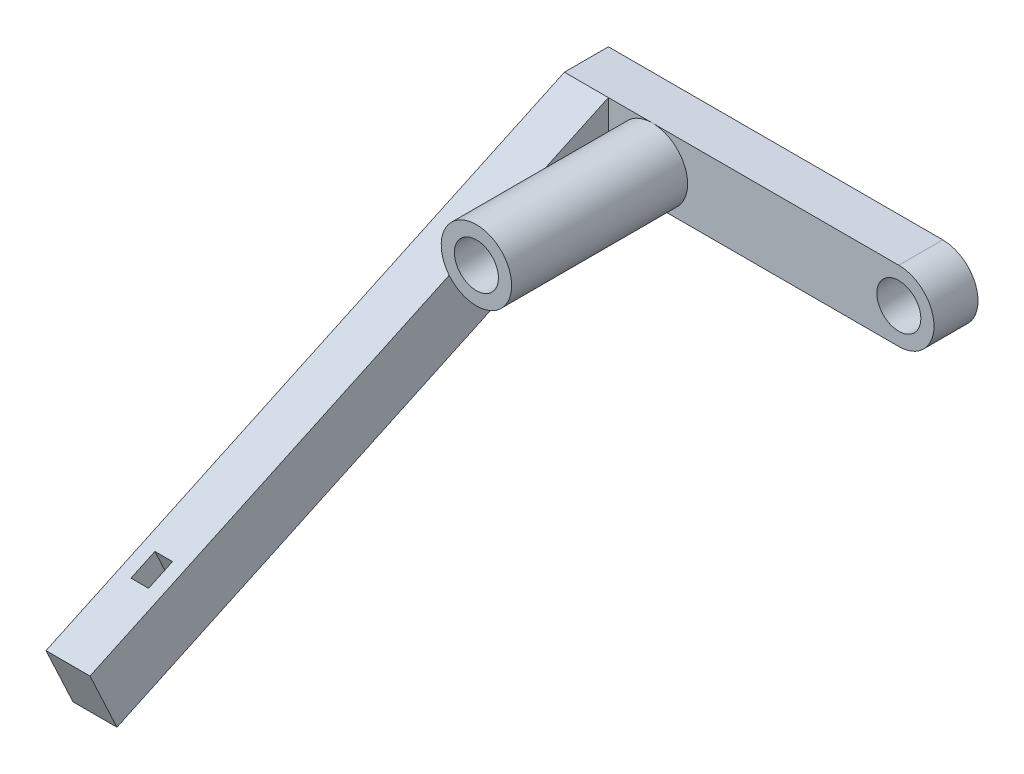
ISO-10303-21;
HEADER;
FILE_DESCRIPTION(('STEP AP214'),'2;1');
FILE_NAME('part.step','',(''),(''),'','','');
FILE_SCHEMA(('AUTOMOTIVE_DESIGN { 1 0 10303 214 1 1 1 1 }'));
ENDSEC;
DATA;
#1=APPLICATION_CONTEXT('core data for automotive mechanical design processes');
#2=APPLICATION_PROTOCOL_DEFINITION('international standard','automotive_design',2000,#1);
#3=PRODUCT_CONTEXT('',#1,'mechanical');
#4=PRODUCT('Part','Part','',(#3));
#5=PRODUCT_RELATED_PRODUCT_CATEGORY('part','',(#4));
#6=PRODUCT_DEFINITION_FORMATION('','',#4);
#7=PRODUCT_DEFINITION_CONTEXT('part definition',#1,'design');
#8=PRODUCT_DEFINITION('design','',#6,#7);
#9=PRODUCT_DEFINITION_SHAPE('','',#8);
#10=(LENGTH_UNIT() NAMED_UNIT(*) SI_UNIT(.MILLI.,.METRE.));
#11=(NAMED_UNIT(*) PLANE_ANGLE_UNIT() SI_UNIT($,.RADIAN.));
#12=(NAMED_UNIT(*) SI_UNIT($,.STERADIAN.) SOLID_ANGLE_UNIT());
#13=UNCERTAINTY_MEASURE_WITH_UNIT(LENGTH_MEASURE(1.E-05),#10,'distance_accuracy_value','');
#14=(GEOMETRIC_REPRESENTATION_CONTEXT(3) GLOBAL_UNCERTAINTY_ASSIGNED_CONTEXT((#13)) GLOBAL_UNIT_ASSIGNED_CONTEXT((#10,
#11,#12)) REPRESENTATION_CONTEXT('',''));
#15=CARTESIAN_POINT('',(0.,0.,0.));
#16=DIRECTION('',(0.,0.,1.));
#17=DIRECTION('',(1.,0.,0.));
#18=AXIS2_PLACEMENT_3D('',#15,#16,#17);
#19=CARTESIAN_POINT('',(14.,30.,7.));
#20=DIRECTION('',(0.,0.,-1.));
#21=DIRECTION('',(-1.,0.,0.));
#22=AXIS2_PLACEMENT_3D('',#19,#20,#21);
#23=PLANE('',#22);
#24=CARTESIAN_POINT('',(14.,30.,7.));
#25=DIRECTION('',(0.,0.,1.));
#26=DIRECTION('',(-1.,0.,0.));
#27=AXIS2_PLACEMENT_3D('',#24,#25,#26);
#28=CIRCLE('',#27,2.5);
#29=CARTESIAN_POINT('',(11.5,30.,7.));
#30=VERTEX_POINT('',#29);
#31=EDGE_CURVE('E218',#30,#30,#28,.T.);
#32=ORIENTED_EDGE('',*,*,#31,.F.);
#33=EDGE_LOOP('',(#32));
#34=FACE_BOUND('',#33,.T.);
#35=CARTESIAN_POINT('',(-14.,30.,7.));
#36=DIRECTION('',(0.,0.,1.));
#37=DIRECTION('',(1.,0.,0.));
#38=AXIS2_PLACEMENT_3D('',#35,#36,#37);
#39=CIRCLE('',#38,4.);
#40=CARTESIAN_POINT('',(-14.,26.,7.));
#41=VERTEX_POINT('',#40);
#42=CARTESIAN_POINT('',(-14.,34.,7.));
#43=VERTEX_POINT('',#42);
#44=EDGE_CURVE('E148',#41,#43,#39,.T.);
#45=ORIENTED_EDGE('',*,*,#44,.F.);
#46=DIRECTION('',(1.,0.,0.));
#47=VECTOR('',#46,1.);
#48=CARTESIAN_POINT('',(-24.,26.,7.));
#49=LINE('',#48,#47);
#50=CARTESIAN_POINT('',(14.,26.,7.));
#51=VERTEX_POINT('',#50);
#52=EDGE_CURVE('E134',#41,#51,#49,.T.);
#53=ORIENTED_EDGE('',*,*,#52,.T.);
#54=CARTESIAN_POINT('',(14.,30.,7.));
#55=DIRECTION('',(0.,0.,1.));
#56=DIRECTION('',(-1.,0.,0.));
#57=AXIS2_PLACEMENT_3D('',#54,#55,#56);
#58=CIRCLE('',#57,4.);
#59=CARTESIAN_POINT('',(14.,34.,7.));
#60=VERTEX_POINT('',#59);
#61=EDGE_CURVE('E224',#51,#60,#58,.T.);
#62=ORIENTED_EDGE('',*,*,#61,.T.);
#63=DIRECTION('',(-1.,0.,0.));
#64=VECTOR('',#63,1.);
#65=CARTESIAN_POINT('',(-14.,34.,7.));
#66=LINE('',#65,#64);
#67=EDGE_CURVE('E145',#60,#43,#66,.T.);
#68=ORIENTED_EDGE('',*,*,#67,.T.);
#69=EDGE_LOOP('',(#45,#53,#62,#68));
#70=FACE_BOUND('',#69,.T.);
#71=ADVANCED_FACE('F37',(#34,#70),#23,.F.);
#72=EDGE_CURVE('E52',#43,#41,#39,.T.);
#73=ORIENTED_EDGE('',*,*,#72,.F.);
#74=CARTESIAN_POINT('',(-19.,34.,7.));
#75=VERTEX_POINT('',#74);
#76=EDGE_CURVE('E222',#43,#75,#66,.T.);
#77=ORIENTED_EDGE('',*,*,#76,.T.);
#78=DIRECTION('',(0.,1.,0.));
#79=VECTOR('',#78,1.);
#80=CARTESIAN_POINT('',(-19.,34.,7.));
#81=LINE('',#80,#79);
#82=CARTESIAN_POINT('',(-19.,26.,7.));
#83=VERTEX_POINT('',#82);
#84=EDGE_CURVE('E129',#83,#75,#81,.T.);
#85=ORIENTED_EDGE('',*,*,#84,.F.);
#86=EDGE_CURVE('E125',#83,#41,#49,.T.);
#87=ORIENTED_EDGE('',*,*,#86,.T.);
#88=EDGE_LOOP('',(#73,#77,#85,#87));
#89=FACE_BOUND('',#88,.T.);
#90=ADVANCED_FACE('F127',(#89),#23,.F.);
#91=CARTESIAN_POINT('',(14.,30.,2.));
#92=DIRECTION('',(0.,0.,-1.));
#93=DIRECTION('',(-1.,0.,0.));
#94=AXIS2_PLACEMENT_3D('',#91,#92,#93);
#95=PLANE('',#94);
#96=DIRECTION('',(-1.,0.,0.));
#97=VECTOR('',#96,1.);
#98=CARTESIAN_POINT('',(14.,34.,2.));
#99=LINE('',#98,#97);
#100=CARTESIAN_POINT('',(14.,34.,2.));
#101=VERTEX_POINT('',#100);
#102=CARTESIAN_POINT('',(-24.,34.,2.));
#103=VERTEX_POINT('',#102);
#104=EDGE_CURVE('E232',#101,#103,#99,.T.);
#105=ORIENTED_EDGE('',*,*,#104,.F.);
#106=CARTESIAN_POINT('',(14.,30.,2.));
#107=DIRECTION('',(0.,0.,1.));
#108=DIRECTION('',(-1.,0.,0.));
#109=AXIS2_PLACEMENT_3D('',#106,#107,#108);
#110=CIRCLE('',#109,4.);
#111=CARTESIAN_POINT('',(14.,26.,2.));
#112=VERTEX_POINT('',#111);
#113=EDGE_CURVE('E230',#112,#101,#110,.T.);
#114=ORIENTED_EDGE('',*,*,#113,.F.);
#115=DIRECTION('',(1.,0.,0.));
#116=VECTOR('',#115,1.);
#117=CARTESIAN_POINT('',(14.,26.,2.));
#118=LINE('',#117,#116);
#119=CARTESIAN_POINT('',(-24.,26.,2.));
#120=VERTEX_POINT('',#119);
#121=EDGE_CURVE('E228',#120,#112,#118,.T.);
#122=ORIENTED_EDGE('',*,*,#121,.F.);
#123=DIRECTION('',(0.,-1.,0.));
#124=VECTOR('',#123,1.);
#125=CARTESIAN_POINT('',(-24.,34.,2.));
#126=LINE('',#125,#124);
#127=EDGE_CURVE('E221',#103,#120,#126,.T.);
#128=ORIENTED_EDGE('',*,*,#127,.F.);
#129=EDGE_LOOP('',(#105,#114,#122,#128));
#130=FACE_BOUND('',#129,.T.);
#131=CARTESIAN_POINT('',(14.,30.,2.));
#132=DIRECTION('',(0.,0.,1.));
#133=DIRECTION('',(1.,0.,0.));
#134=AXIS2_PLACEMENT_3D('',#131,#132,#133);
#135=CIRCLE('',#134,2.5);
#136=CARTESIAN_POINT('',(16.5,30.,2.));
#137=VERTEX_POINT('',#136);
#138=EDGE_CURVE('E212',#137,#137,#135,.T.);
#139=ORIENTED_EDGE('',*,*,#138,.T.);
#140=EDGE_LOOP('',(#139));
#141=FACE_BOUND('',#140,.T.);
#142=CARTESIAN_POINT('',(-14.,30.,2.));
#143=DIRECTION('',(0.,0.,1.));
#144=DIRECTION('',(1.,0.,0.));
#145=AXIS2_PLACEMENT_3D('',#142,#143,#144);
#146=CIRCLE('',#145,2.5);
#147=CARTESIAN_POINT('',(-11.5,30.,2.));
#148=VERTEX_POINT('',#147);
#149=EDGE_CURVE('E215',#148,#148,#146,.T.);
#150=ORIENTED_EDGE('',*,*,#149,.T.);
#151=EDGE_LOOP('',(#150));
#152=FACE_BOUND('',#151,.T.);
#153=ADVANCED_FACE('F245',(#130,#141,#152),#95,.T.);
#154=CARTESIAN_POINT('',(-24.,34.,7.));
#155=DIRECTION('',(1.,0.,0.));
#156=DIRECTION('',(0.,0.,-1.));
#157=AXIS2_PLACEMENT_3D('',#154,#155,#156);
#158=PLANE('',#157);
#159=DIRECTION('',(0.,0.422618261740698,-0.906307787036651));
#160=VECTOR('',#159,1.);
#161=CARTESIAN_POINT('',(-24.,-1.47018701314536,65.9100061573823));
#162=LINE('',#161,#160);
#163=CARTESIAN_POINT('',(-24.,-0.0413374518915309,62.8458283849064));
#164=VERTEX_POINT('',#163);
#165=CARTESIAN_POINT('',(-24.,26.,7.));
#166=VERTEX_POINT('',#165);
#167=EDGE_CURVE('E210',#164,#166,#162,.T.);
#168=ORIENTED_EDGE('',*,*,#167,.F.);
#169=DIRECTION('',(0.,-0.906307787036652,-0.422618261740694));
#170=VECTOR('',#169,1.);
#171=CARTESIAN_POINT('',(-24.,6.52981298685465,65.9100061573823));
#172=LINE('',#171,#170);
#173=CARTESIAN_POINT('',(-24.,6.52981298685465,65.9100061573823));
#174=VERTEX_POINT('',#173);
#175=EDGE_CURVE('E183',#174,#164,#172,.T.);
#176=ORIENTED_EDGE('',*,*,#175,.F.);
#177=DIRECTION('',(0.,0.422618261740698,-0.906307787036651));
#178=VECTOR('',#177,1.);
#179=CARTESIAN_POINT('',(-24.,6.52981298685464,65.9100061573823));
#180=LINE('',#179,#178);
#181=CARTESIAN_POINT('',(-24.,34.,7.));
#182=VERTEX_POINT('',#181);
#183=EDGE_CURVE('E198',#174,#182,#180,.T.);
#184=ORIENTED_EDGE('',*,*,#183,.T.);
#185=DIRECTION('',(0.,0.,-1.));
#186=VECTOR('',#185,1.);
#187=CARTESIAN_POINT('',(-24.,34.,7.));
#188=LINE('',#187,#186);
#189=EDGE_CURVE('E11',#182,#103,#188,.T.);
#190=ORIENTED_EDGE('',*,*,#189,.T.);
#191=ORIENTED_EDGE('',*,*,#127,.T.);
#192=DIRECTION('',(0.,0.,-1.));
#193=VECTOR('',#192,1.);
#194=CARTESIAN_POINT('',(-24.,26.,7.));
#195=LINE('',#194,#193);
#196=EDGE_CURVE('E45',#166,#120,#195,.T.);
#197=ORIENTED_EDGE('',*,*,#196,.F.);
#198=EDGE_LOOP('',(#168,#176,#184,#190,#191,#197));
#199=FACE_BOUND('',#198,.T.);
#200=ADVANCED_FACE('F39',(#199),#158,.F.);
#201=CARTESIAN_POINT('',(14.,26.,7.));
#202=DIRECTION('',(0.,1.,0.));
#203=DIRECTION('',(0.,0.,1.));
#204=AXIS2_PLACEMENT_3D('',#201,#202,#203);
#205=PLANE('',#204);
#206=ORIENTED_EDGE('',*,*,#121,.T.);
#207=DIRECTION('',(0.,0.,-1.));
#208=VECTOR('',#207,1.);
#209=CARTESIAN_POINT('',(14.,26.,7.));
#210=LINE('',#209,#208);
#211=EDGE_CURVE('E141',#51,#112,#210,.T.);
#212=ORIENTED_EDGE('',*,*,#211,.F.);
#213=ORIENTED_EDGE('',*,*,#52,.F.);
#214=ORIENTED_EDGE('',*,*,#86,.F.);
#215=EDGE_CURVE('E133',#166,#83,#49,.T.);
#216=ORIENTED_EDGE('',*,*,#215,.F.);
#217=ORIENTED_EDGE('',*,*,#196,.T.);
#218=EDGE_LOOP('',(#206,#212,#213,#214,#216,#217));
#219=FACE_BOUND('',#218,.T.);
#220=ADVANCED_FACE('F139',(#219),#205,.F.);
#221=CARTESIAN_POINT('',(14.,30.,7.));
#222=DIRECTION('',(0.,0.,-1.));
#223=DIRECTION('',(-1.,0.,0.));
#224=AXIS2_PLACEMENT_3D('',#221,#222,#223);
#225=CYLINDRICAL_SURFACE('',#224,4.);
#226=ORIENTED_EDGE('',*,*,#113,.T.);
#227=DIRECTION('',(0.,0.,-1.));
#228=VECTOR('',#227,1.);
#229=CARTESIAN_POINT('',(14.,34.,7.));
#230=LINE('',#229,#228);
#231=EDGE_CURVE('E226',#60,#101,#230,.T.);
#232=ORIENTED_EDGE('',*,*,#231,.F.);
#233=ORIENTED_EDGE('',*,*,#61,.F.);
#234=ORIENTED_EDGE('',*,*,#211,.T.);
#235=EDGE_LOOP('',(#226,#232,#233,#234));
#236=FACE_BOUND('',#235,.T.);
#237=ADVANCED_FACE('F249',(#236),#225,.T.);
#238=CARTESIAN_POINT('',(14.,34.,7.));
#239=DIRECTION('',(0.,-1.,0.));
#240=DIRECTION('',(0.,0.,-1.));
#241=AXIS2_PLACEMENT_3D('',#238,#239,#240);
#242=PLANE('',#241);
#243=ORIENTED_EDGE('',*,*,#104,.T.);
#244=ORIENTED_EDGE('',*,*,#189,.F.);
#245=DIRECTION('',(-1.,0.,0.));
#246=VECTOR('',#245,1.);
#247=CARTESIAN_POINT('',(-24.,34.,7.));
#248=LINE('',#247,#246);
#249=EDGE_CURVE('E199',#75,#182,#248,.T.);
#250=ORIENTED_EDGE('',*,*,#249,.F.);
#251=ORIENTED_EDGE('',*,*,#76,.F.);
#252=ORIENTED_EDGE('',*,*,#67,.F.);
#253=ORIENTED_EDGE('',*,*,#231,.T.);
#254=EDGE_LOOP('',(#243,#244,#250,#251,#252,#253));
#255=FACE_BOUND('',#254,.T.);
#256=ADVANCED_FACE('F251',(#255),#242,.F.);
#257=CARTESIAN_POINT('',(-14.,30.,7.));
#258=DIRECTION('',(0.,0.,-1.));
#259=DIRECTION('',(-1.,0.,0.));
#260=AXIS2_PLACEMENT_3D('',#257,#258,#259);
#261=CYLINDRICAL_SURFACE('',#260,2.5);
#262=ORIENTED_EDGE('',*,*,#149,.F.);
#263=EDGE_LOOP('',(#262));
#264=FACE_BOUND('',#263,.T.);
#265=CARTESIAN_POINT('',(-14.,30.,27.));
#266=DIRECTION('',(0.,0.,1.));
#267=DIRECTION('',(1.,0.,0.));
#268=AXIS2_PLACEMENT_3D('',#265,#266,#267);
#269=CIRCLE('',#268,2.5);
#270=CARTESIAN_POINT('',(-11.5,30.,27.));
#271=VERTEX_POINT('',#270);
#272=EDGE_CURVE('E150',#271,#271,#269,.T.);
#273=ORIENTED_EDGE('',*,*,#272,.T.);
#274=EDGE_LOOP('',(#273));
#275=FACE_BOUND('',#274,.T.);
#276=ADVANCED_FACE('F274',(#264,#275),#261,.F.);
#277=CARTESIAN_POINT('',(14.,30.,7.));
#278=DIRECTION('',(0.,0.,-1.));
#279=DIRECTION('',(-1.,0.,0.));
#280=AXIS2_PLACEMENT_3D('',#277,#278,#279);
#281=CYLINDRICAL_SURFACE('',#280,2.5);
#282=ORIENTED_EDGE('',*,*,#31,.T.);
#283=EDGE_LOOP('',(#282));
#284=FACE_BOUND('',#283,.T.);
#285=ORIENTED_EDGE('',*,*,#138,.F.);
#286=EDGE_LOOP('',(#285));
#287=FACE_BOUND('',#286,.T.);
#288=ADVANCED_FACE('F266',(#284,#287),#281,.F.);
#289=CARTESIAN_POINT('',(-24.,-1.47018701314536,65.9100061573823));
#290=DIRECTION('',(0.,0.906307787036651,0.422618261740698));
#291=DIRECTION('',(0.,-0.422618261740698,0.906307787036651));
#292=AXIS2_PLACEMENT_3D('',#289,#290,#291);
#293=PLANE('',#292);
#294=DIRECTION('',(1.,0.,0.));
#295=VECTOR('',#294,1.);
#296=CARTESIAN_POINT('',(-22.5,5.03008168899686,51.9701349404666));
#297=LINE('',#296,#295);
#298=CARTESIAN_POINT('',(-22.5,5.03008168899683,51.9701349404666));
#299=VERTEX_POINT('',#298);
#300=CARTESIAN_POINT('',(-20.5,5.03008168899686,51.9701349404666));
#301=VERTEX_POINT('',#300);
#302=EDGE_CURVE('E173',#299,#301,#297,.T.);
#303=ORIENTED_EDGE('',*,*,#302,.F.);
#304=DIRECTION('',(0.,0.422618261740698,-0.906307787036651));
#305=VECTOR('',#304,1.);
#306=CARTESIAN_POINT('',(-22.5,3.76222690377476,54.6890583015766));
#307=LINE('',#306,#305);
#308=CARTESIAN_POINT('',(-22.5,3.76222690377476,54.6890583015766));
#309=VERTEX_POINT('',#308);
#310=EDGE_CURVE('E60',#309,#299,#307,.T.);
#311=ORIENTED_EDGE('',*,*,#310,.F.);
#312=DIRECTION('',(-1.,0.,0.));
#313=VECTOR('',#312,1.);
#314=CARTESIAN_POINT('',(-22.5,3.76222690377476,54.6890583015766));
#315=LINE('',#314,#313);
#316=CARTESIAN_POINT('',(-20.5,3.76222690377476,54.6890583015766));
#317=VERTEX_POINT('',#316);
#318=EDGE_CURVE('E162',#317,#309,#315,.T.);
#319=ORIENTED_EDGE('',*,*,#318,.F.);
#320=DIRECTION('',(0.,-0.422618261740698,0.906307787036651));
#321=VECTOR('',#320,1.);
#322=CARTESIAN_POINT('',(-20.5,3.76222690377476,54.6890583015766));
#323=LINE('',#322,#321);
#324=EDGE_CURVE('E176',#301,#317,#323,.T.);
#325=ORIENTED_EDGE('',*,*,#324,.F.);
#326=EDGE_LOOP('',(#303,#311,#319,#325));
#327=FACE_BOUND('',#326,.T.);
#328=DIRECTION('',(0.,0.422618261740698,-0.906307787036651));
#329=VECTOR('',#328,1.);
#330=CARTESIAN_POINT('',(-19.,-1.47018701314536,65.9100061573823));
#331=LINE('',#330,#329);
#332=CARTESIAN_POINT('',(-19.,-0.0413374518915309,62.8458283849064));
#333=VERTEX_POINT('',#332);
#334=EDGE_CURVE('E208',#333,#83,#331,.T.);
#335=ORIENTED_EDGE('',*,*,#334,.F.);
#336=DIRECTION('',(-1.,0.,0.));
#337=VECTOR('',#336,1.);
#338=CARTESIAN_POINT('',(-19.,-0.0413374518915309,62.8458283849064));
#339=LINE('',#338,#337);
#340=EDGE_CURVE('E192',#333,#164,#339,.T.);
#341=ORIENTED_EDGE('',*,*,#340,.T.);
#342=ORIENTED_EDGE('',*,*,#167,.T.);
#343=ORIENTED_EDGE('',*,*,#215,.T.);
#344=EDGE_LOOP('',(#335,#341,#342,#343));
#345=FACE_BOUND('',#344,.T.);
#346=ADVANCED_FACE('F264',(#327,#345),#293,.F.);
#347=CARTESIAN_POINT('',(-19.,6.52981298685464,65.9100061573823));
#348=DIRECTION('',(-1.,0.,0.));
#349=DIRECTION('',(0.,0.,1.));
#350=AXIS2_PLACEMENT_3D('',#347,#348,#349);
#351=PLANE('',#350);
#352=DIRECTION('',(0.,0.422618261740698,-0.906307787036651));
#353=VECTOR('',#352,1.);
#354=CARTESIAN_POINT('',(-19.,6.52981298685464,65.9100061573823));
#355=LINE('',#354,#353);
#356=CARTESIAN_POINT('',(-19.,6.52981298685464,65.9100061573823));
#357=VERTEX_POINT('',#356);
#358=EDGE_CURVE('E205',#357,#75,#355,.T.);
#359=ORIENTED_EDGE('',*,*,#358,.F.);
#360=DIRECTION('',(0.,-0.906307787036652,-0.422618261740694));
#361=VECTOR('',#360,1.);
#362=CARTESIAN_POINT('',(-19.,6.52981298685465,65.9100061573823));
#363=LINE('',#362,#361);
#364=EDGE_CURVE('E189',#357,#333,#363,.T.);
#365=ORIENTED_EDGE('',*,*,#364,.T.);
#366=ORIENTED_EDGE('',*,*,#334,.T.);
#367=ORIENTED_EDGE('',*,*,#84,.T.);
#368=EDGE_LOOP('',(#359,#365,#366,#367));
#369=FACE_BOUND('',#368,.T.);
#370=ADVANCED_FACE('F257',(#369),#351,.F.);
#371=CARTESIAN_POINT('',(-24.,6.52981298685464,65.9100061573823));
#372=DIRECTION('',(0.,-0.906307787036651,-0.422618261740698));
#373=DIRECTION('',(0.,0.422618261740698,-0.906307787036651));
#374=AXIS2_PLACEMENT_3D('',#371,#372,#373);
#375=PLANE('',#374);
#376=DIRECTION('',(-1.,0.,0.));
#377=VECTOR('',#376,1.);
#378=CARTESIAN_POINT('',(-22.5,10.3333773425209,57.7532360740525));
#379=LINE('',#378,#377);
#380=CARTESIAN_POINT('',(-20.5,10.3333773425209,57.7532360740525));
#381=VERTEX_POINT('',#380);
#382=CARTESIAN_POINT('',(-22.5,10.3333773425209,57.7532360740525));
#383=VERTEX_POINT('',#382);
#384=EDGE_CURVE('E168',#381,#383,#379,.T.);
#385=ORIENTED_EDGE('',*,*,#384,.T.);
#386=DIRECTION('',(0.,0.422618261740698,-0.906307787036651));
#387=VECTOR('',#386,1.);
#388=CARTESIAN_POINT('',(-22.5,10.3333773425209,57.7532360740525));
#389=LINE('',#388,#387);
#390=CARTESIAN_POINT('',(-22.5,11.601232127743,55.0343127129425));
#391=VERTEX_POINT('',#390);
#392=EDGE_CURVE('E158',#383,#391,#389,.T.);
#393=ORIENTED_EDGE('',*,*,#392,.T.);
#394=DIRECTION('',(1.,0.,0.));
#395=VECTOR('',#394,1.);
#396=CARTESIAN_POINT('',(-22.5,11.601232127743,55.0343127129425));
#397=LINE('',#396,#395);
#398=CARTESIAN_POINT('',(-20.5,11.601232127743,55.0343127129425));
#399=VERTEX_POINT('',#398);
#400=EDGE_CURVE('E161',#391,#399,#397,.T.);
#401=ORIENTED_EDGE('',*,*,#400,.T.);
#402=DIRECTION('',(0.,-0.422618261740698,0.906307787036651));
#403=VECTOR('',#402,1.);
#404=CARTESIAN_POINT('',(-20.5,10.3333773425209,57.7532360740525));
#405=LINE('',#404,#403);
#406=EDGE_CURVE('E165',#399,#381,#405,.T.);
#407=ORIENTED_EDGE('',*,*,#406,.T.);
#408=EDGE_LOOP('',(#385,#393,#401,#407));
#409=FACE_BOUND('',#408,.T.);
#410=ORIENTED_EDGE('',*,*,#249,.T.);
#411=ORIENTED_EDGE('',*,*,#183,.F.);
#412=DIRECTION('',(-1.,0.,0.));
#413=VECTOR('',#412,1.);
#414=CARTESIAN_POINT('',(-24.,6.52981298685464,65.9100061573823));
#415=LINE('',#414,#413);
#416=EDGE_CURVE('E196',#357,#174,#415,.T.);
#417=ORIENTED_EDGE('',*,*,#416,.F.);
#418=ORIENTED_EDGE('',*,*,#358,.T.);
#419=EDGE_LOOP('',(#410,#411,#417,#418));
#420=FACE_BOUND('',#419,.T.);
#421=ADVANCED_FACE('F260',(#409,#420),#375,.F.);
#422=CARTESIAN_POINT('',(-19.,6.52981298685465,65.9100061573823));
#423=DIRECTION('',(0.,0.422618261740694,-0.906307787036652));
#424=DIRECTION('',(0.,0.906307787036652,0.422618261740694));
#425=AXIS2_PLACEMENT_3D('',#422,#423,#424);
#426=PLANE('',#425);
#427=ORIENTED_EDGE('',*,*,#175,.T.);
#428=ORIENTED_EDGE('',*,*,#340,.F.);
#429=ORIENTED_EDGE('',*,*,#364,.F.);
#430=ORIENTED_EDGE('',*,*,#416,.T.);
#431=EDGE_LOOP('',(#427,#428,#429,#430));
#432=FACE_BOUND('',#431,.T.);
#433=ADVANCED_FACE('F262',(#432),#426,.F.);
#434=CARTESIAN_POINT('',(-22.5,10.3333773425209,57.7532360740525));
#435=DIRECTION('',(-1.,0.,0.));
#436=DIRECTION('',(0.,0.,1.));
#437=AXIS2_PLACEMENT_3D('',#434,#435,#436);
#438=PLANE('',#437);
#439=ORIENTED_EDGE('',*,*,#310,.T.);
#440=DIRECTION('',(0.,-0.906307787036651,-0.422618261740697));
#441=VECTOR('',#440,1.);
#442=CARTESIAN_POINT('',(-22.5,11.601232127743,55.0343127129425));
#443=LINE('',#442,#441);
#444=EDGE_CURVE('E171',#391,#299,#443,.T.);
#445=ORIENTED_EDGE('',*,*,#444,.F.);
#446=ORIENTED_EDGE('',*,*,#392,.F.);
#447=DIRECTION('',(0.,-0.906307787036651,-0.422618261740697));
#448=VECTOR('',#447,1.);
#449=CARTESIAN_POINT('',(-22.5,10.3333773425209,57.7532360740525));
#450=LINE('',#449,#448);
#451=EDGE_CURVE('E181',#383,#309,#450,.T.);
#452=ORIENTED_EDGE('',*,*,#451,.T.);
#453=EDGE_LOOP('',(#439,#445,#446,#452));
#454=FACE_BOUND('',#453,.T.);
#455=ADVANCED_FACE('F348',(#454),#438,.F.);
#456=CARTESIAN_POINT('',(-22.5,10.3333773425209,57.7532360740525));
#457=DIRECTION('',(0.,-0.422618261740697,0.906307787036651));
#458=DIRECTION('',(0.,-0.906307787036651,-0.422618261740698));
#459=AXIS2_PLACEMENT_3D('',#456,#457,#458);
#460=PLANE('',#459);
#461=ORIENTED_EDGE('',*,*,#318,.T.);
#462=ORIENTED_EDGE('',*,*,#451,.F.);
#463=ORIENTED_EDGE('',*,*,#384,.F.);
#464=DIRECTION('',(0.,-0.906307787036651,-0.422618261740697));
#465=VECTOR('',#464,1.);
#466=CARTESIAN_POINT('',(-20.5,10.3333773425209,57.7532360740525));
#467=LINE('',#466,#465);
#468=EDGE_CURVE('E184',#381,#317,#467,.T.);
#469=ORIENTED_EDGE('',*,*,#468,.T.);
#470=EDGE_LOOP('',(#461,#462,#463,#469));
#471=FACE_BOUND('',#470,.T.);
#472=ADVANCED_FACE('F338',(#471),#460,.F.);
#473=CARTESIAN_POINT('',(-20.5,10.3333773425209,57.7532360740525));
#474=DIRECTION('',(1.,0.,0.));
#475=DIRECTION('',(0.,0.,-1.));
#476=AXIS2_PLACEMENT_3D('',#473,#474,#475);
#477=PLANE('',#476);
#478=ORIENTED_EDGE('',*,*,#324,.T.);
#479=ORIENTED_EDGE('',*,*,#468,.F.);
#480=ORIENTED_EDGE('',*,*,#406,.F.);
#481=DIRECTION('',(0.,-0.906307787036651,-0.422618261740697));
#482=VECTOR('',#481,1.);
#483=CARTESIAN_POINT('',(-20.5,11.601232127743,55.0343127129425));
#484=LINE('',#483,#482);
#485=EDGE_CURVE('E186',#399,#301,#484,.T.);
#486=ORIENTED_EDGE('',*,*,#485,.T.);
#487=EDGE_LOOP('',(#478,#479,#480,#486));
#488=FACE_BOUND('',#487,.T.);
#489=ADVANCED_FACE('F327',(#488),#477,.F.);
#490=CARTESIAN_POINT('',(-22.5,11.601232127743,55.0343127129425));
#491=DIRECTION('',(0.,0.422618261740697,-0.906307787036651));
#492=DIRECTION('',(0.,0.906307787036651,0.422618261740698));
#493=AXIS2_PLACEMENT_3D('',#490,#491,#492);
#494=PLANE('',#493);
#495=ORIENTED_EDGE('',*,*,#302,.T.);
#496=ORIENTED_EDGE('',*,*,#485,.F.);
#497=ORIENTED_EDGE('',*,*,#400,.F.);
#498=ORIENTED_EDGE('',*,*,#444,.T.);
#499=EDGE_LOOP('',(#495,#496,#497,#498));
#500=FACE_BOUND('',#499,.T.);
#501=ADVANCED_FACE('F321',(#500),#494,.F.);
#502=CARTESIAN_POINT('',(-14.,30.,27.));
#503=DIRECTION('',(0.,0.,1.));
#504=DIRECTION('',(1.,0.,0.));
#505=AXIS2_PLACEMENT_3D('',#502,#503,#504);
#506=PLANE('',#505);
#507=CARTESIAN_POINT('',(-14.,30.,27.));
#508=DIRECTION('',(0.,0.,1.));
#509=DIRECTION('',(1.,0.,0.));
#510=AXIS2_PLACEMENT_3D('',#507,#508,#509);
#511=CIRCLE('',#510,4.);
#512=CARTESIAN_POINT('',(-10.,30.,27.));
#513=VERTEX_POINT('',#512);
#514=EDGE_CURVE('E153',#513,#513,#511,.T.);
#515=ORIENTED_EDGE('',*,*,#514,.T.);
#516=EDGE_LOOP('',(#515));
#517=FACE_BOUND('',#516,.T.);
#518=ORIENTED_EDGE('',*,*,#272,.F.);
#519=EDGE_LOOP('',(#518));
#520=FACE_BOUND('',#519,.T.);
#521=ADVANCED_FACE('F326',(#517,#520),#506,.T.);
#522=CARTESIAN_POINT('',(-14.,30.,27.));
#523=DIRECTION('',(0.,0.,-1.));
#524=DIRECTION('',(-1.,0.,0.));
#525=AXIS2_PLACEMENT_3D('',#522,#523,#524);
#526=CYLINDRICAL_SURFACE('',#525,4.);
#527=ORIENTED_EDGE('',*,*,#514,.F.);
#528=EDGE_LOOP('',(#527));
#529=FACE_BOUND('',#528,.T.);
#530=ORIENTED_EDGE('',*,*,#72,.T.);
#531=ORIENTED_EDGE('',*,*,#44,.T.);
#532=EDGE_LOOP('',(#530,#531));
#533=FACE_BOUND('',#532,.T.);
#534=ADVANCED_FACE('F152',(#529,#533),#526,.T.);
#535=CLOSED_SHELL('',(#71,#90,#153,#200,#220,#237,#256,#276,#288,#346,#370,#421,#433,#455,#472,
#489,#501,#521,#534));
#536=MANIFOLD_SOLID_BREP('B2',#535);
#537=ADVANCED_BREP_SHAPE_REPRESENTATION('',(#18,#536),#14);
#538=SHAPE_DEFINITION_REPRESENTATION(#9,#537);
ENDSEC;
END-ISO-10303-21;
